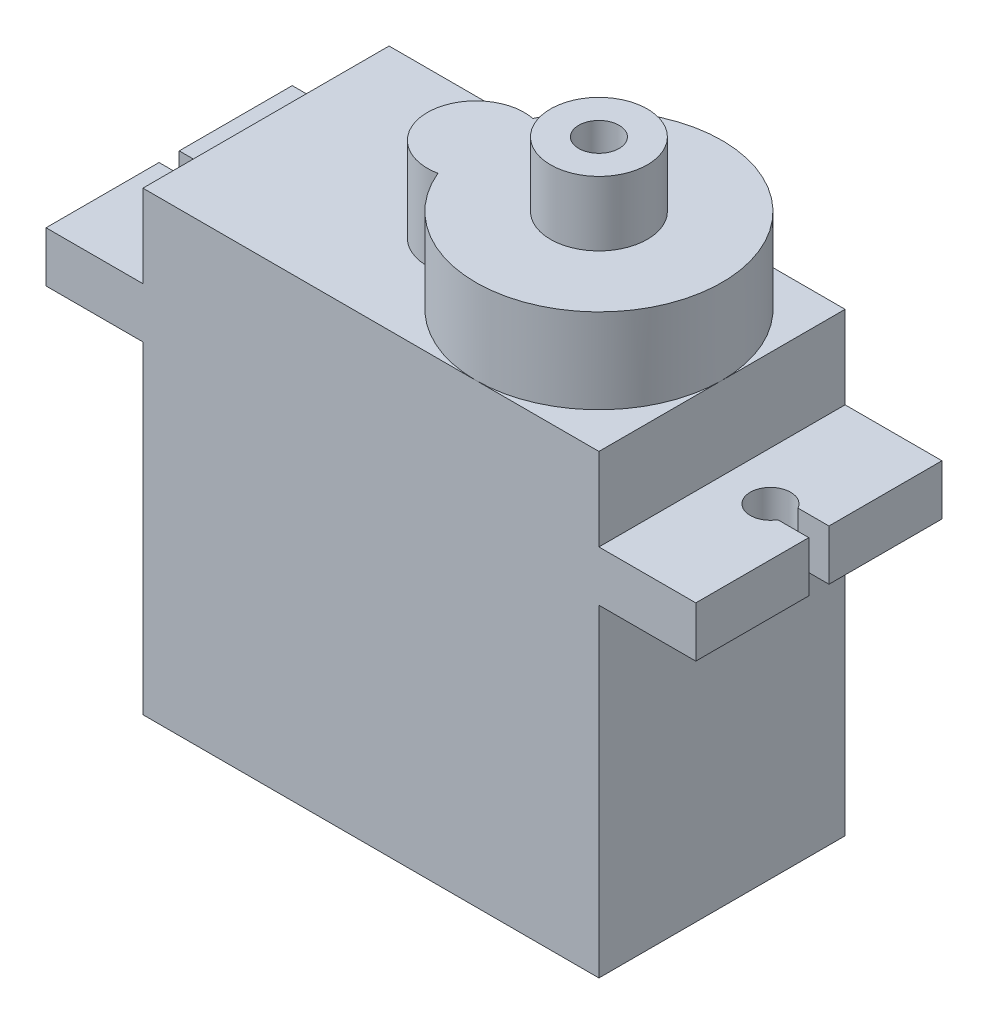
ISO-10303-21;
HEADER;
FILE_DESCRIPTION(('STEP AP214'),'2;1');
FILE_NAME('part.step','',(''),(''),'','','');
FILE_SCHEMA(('AUTOMOTIVE_DESIGN { 1 0 10303 214 1 1 1 1 }'));
ENDSEC;
DATA;
#1=APPLICATION_CONTEXT('core data for automotive mechanical design processes');
#2=APPLICATION_PROTOCOL_DEFINITION('international standard','automotive_design',2000,#1);
#3=PRODUCT_CONTEXT('',#1,'mechanical');
#4=PRODUCT('Part','Part','',(#3));
#5=PRODUCT_RELATED_PRODUCT_CATEGORY('part','',(#4));
#6=PRODUCT_DEFINITION_FORMATION('','',#4);
#7=PRODUCT_DEFINITION_CONTEXT('part definition',#1,'design');
#8=PRODUCT_DEFINITION('design','',#6,#7);
#9=PRODUCT_DEFINITION_SHAPE('','',#8);
#10=(LENGTH_UNIT() NAMED_UNIT(*) SI_UNIT(.MILLI.,.METRE.));
#11=(NAMED_UNIT(*) PLANE_ANGLE_UNIT() SI_UNIT($,.RADIAN.));
#12=(NAMED_UNIT(*) SI_UNIT($,.STERADIAN.) SOLID_ANGLE_UNIT());
#13=UNCERTAINTY_MEASURE_WITH_UNIT(LENGTH_MEASURE(1.E-05),#10,'distance_accuracy_value','');
#14=(GEOMETRIC_REPRESENTATION_CONTEXT(3) GLOBAL_UNCERTAINTY_ASSIGNED_CONTEXT((#13)) GLOBAL_UNIT_ASSIGNED_CONTEXT((#10,
#11,#12)) REPRESENTATION_CONTEXT('',''));
#15=CARTESIAN_POINT('',(0.,0.,0.));
#16=DIRECTION('',(0.,0.,1.));
#17=DIRECTION('',(1.,0.,0.));
#18=AXIS2_PLACEMENT_3D('',#15,#16,#17);
#19=CARTESIAN_POINT('',(-16.1,0.,0.));
#20=DIRECTION('',(1.,0.,0.));
#21=DIRECTION('',(0.,0.,-1.));
#22=AXIS2_PLACEMENT_3D('',#19,#20,#21);
#23=PLANE('',#22);
#24=DIRECTION('',(0.,0.,1.));
#25=VECTOR('',#24,1.);
#26=CARTESIAN_POINT('',(-16.1,16.,-6.1));
#27=LINE('',#26,#25);
#28=CARTESIAN_POINT('',(-16.1,16.,-6.1));
#29=VERTEX_POINT('',#28);
#30=CARTESIAN_POINT('',(-16.1,16.,-0.5));
#31=VERTEX_POINT('',#30);
#32=EDGE_CURVE('E214',#29,#31,#27,.T.);
#33=ORIENTED_EDGE('',*,*,#32,.T.);
#34=DIRECTION('',(0.,1.,0.));
#35=VECTOR('',#34,1.);
#36=CARTESIAN_POINT('',(-16.1,0.,-0.5));
#37=LINE('',#36,#35);
#38=CARTESIAN_POINT('',(-16.1,18.5,-0.5));
#39=VERTEX_POINT('',#38);
#40=EDGE_CURVE('E11',#31,#39,#37,.T.);
#41=ORIENTED_EDGE('',*,*,#40,.T.);
#42=DIRECTION('',(0.,0.,-1.));
#43=VECTOR('',#42,1.);
#44=CARTESIAN_POINT('',(-16.1,18.5,-6.1));
#45=LINE('',#44,#43);
#46=CARTESIAN_POINT('',(-16.1,18.5,-6.1));
#47=VERTEX_POINT('',#46);
#48=EDGE_CURVE('E212',#39,#47,#45,.T.);
#49=ORIENTED_EDGE('',*,*,#48,.T.);
#50=DIRECTION('',(0.,-1.,0.));
#51=VECTOR('',#50,1.);
#52=CARTESIAN_POINT('',(-16.1,16.,-6.1));
#53=LINE('',#52,#51);
#54=EDGE_CURVE('E238',#47,#29,#53,.T.);
#55=ORIENTED_EDGE('',*,*,#54,.T.);
#56=EDGE_LOOP('',(#33,#41,#49,#55));
#57=FACE_BOUND('',#56,.T.);
#58=ADVANCED_FACE('F38',(#57),#23,.F.);
#59=CARTESIAN_POINT('',(16.1,0.,0.));
#60=DIRECTION('',(-1.,0.,0.));
#61=DIRECTION('',(0.,0.,1.));
#62=AXIS2_PLACEMENT_3D('',#59,#60,#61);
#63=PLANE('',#62);
#64=DIRECTION('',(0.,-1.,0.));
#65=VECTOR('',#64,1.);
#66=CARTESIAN_POINT('',(16.1,0.,0.5));
#67=LINE('',#66,#65);
#68=CARTESIAN_POINT('',(16.1,18.5,0.5));
#69=VERTEX_POINT('',#68);
#70=CARTESIAN_POINT('',(16.1,16.,0.5));
#71=VERTEX_POINT('',#70);
#72=EDGE_CURVE('E307',#69,#71,#67,.T.);
#73=ORIENTED_EDGE('',*,*,#72,.F.);
#74=DIRECTION('',(0.,0.,1.));
#75=VECTOR('',#74,1.);
#76=CARTESIAN_POINT('',(16.1,18.5,6.1));
#77=LINE('',#76,#75);
#78=CARTESIAN_POINT('',(16.1,18.5,6.1));
#79=VERTEX_POINT('',#78);
#80=EDGE_CURVE('E361',#69,#79,#77,.T.);
#81=ORIENTED_EDGE('',*,*,#80,.T.);
#82=DIRECTION('',(0.,-1.,0.));
#83=VECTOR('',#82,1.);
#84=CARTESIAN_POINT('',(16.1,16.,6.1));
#85=LINE('',#84,#83);
#86=CARTESIAN_POINT('',(16.1,16.,6.1));
#87=VERTEX_POINT('',#86);
#88=EDGE_CURVE('E352',#79,#87,#85,.T.);
#89=ORIENTED_EDGE('',*,*,#88,.T.);
#90=DIRECTION('',(0.,0.,-1.));
#91=VECTOR('',#90,1.);
#92=CARTESIAN_POINT('',(16.1,16.,6.1));
#93=LINE('',#92,#91);
#94=EDGE_CURVE('E365',#87,#71,#93,.T.);
#95=ORIENTED_EDGE('',*,*,#94,.T.);
#96=EDGE_LOOP('',(#73,#81,#89,#95));
#97=FACE_BOUND('',#96,.T.);
#98=ADVANCED_FACE('F520',(#97),#63,.F.);
#99=CARTESIAN_POINT('',(0.,22.6,0.));
#100=DIRECTION('',(0.,-1.,0.));
#101=DIRECTION('',(0.,0.,-1.));
#102=AXIS2_PLACEMENT_3D('',#99,#100,#101);
#103=PLANE('',#102);
#104=CARTESIAN_POINT('',(-0.9,22.6,0.));
#105=DIRECTION('',(0.,1.,0.));
#106=DIRECTION('',(0.,0.,1.));
#107=AXIS2_PLACEMENT_3D('',#104,#105,#106);
#108=CIRCLE('',#107,2.4);
#109=CARTESIAN_POINT('',(-0.427868852459018,22.6,-2.35310267084154));
#110=VERTEX_POINT('',#109);
#111=CARTESIAN_POINT('',(-0.427868852459017,22.6,2.35310267084155));
#112=VERTEX_POINT('',#111);
#113=EDGE_CURVE('E386',#110,#112,#108,.T.);
#114=ORIENTED_EDGE('',*,*,#113,.F.);
#115=CARTESIAN_POINT('',(5.2,22.6,0.));
#116=DIRECTION('',(0.,1.,0.));
#117=DIRECTION('',(0.,0.,1.));
#118=AXIS2_PLACEMENT_3D('',#115,#116,#117);
#119=CIRCLE('',#118,6.1);
#120=CARTESIAN_POINT('',(5.2,22.6,-6.1));
#121=VERTEX_POINT('',#120);
#122=EDGE_CURVE('E306',#121,#110,#119,.T.);
#123=ORIENTED_EDGE('',*,*,#122,.F.);
#124=DIRECTION('',(-1.,0.,0.));
#125=VECTOR('',#124,1.);
#126=CARTESIAN_POINT('',(11.3,22.6,-6.1));
#127=LINE('',#126,#125);
#128=CARTESIAN_POINT('',(-11.3,22.6,-6.1));
#129=VERTEX_POINT('',#128);
#130=EDGE_CURVE('E269',#121,#129,#127,.T.);
#131=ORIENTED_EDGE('',*,*,#130,.T.);
#132=DIRECTION('',(0.,0.,1.));
#133=VECTOR('',#132,1.);
#134=CARTESIAN_POINT('',(-11.3,22.6,-6.1));
#135=LINE('',#134,#133);
#136=CARTESIAN_POINT('',(-11.3,22.6,6.1));
#137=VERTEX_POINT('',#136);
#138=EDGE_CURVE('E254',#129,#137,#135,.T.);
#139=ORIENTED_EDGE('',*,*,#138,.T.);
#140=DIRECTION('',(1.,0.,0.));
#141=VECTOR('',#140,1.);
#142=CARTESIAN_POINT('',(11.3,22.6,6.1));
#143=LINE('',#142,#141);
#144=CARTESIAN_POINT('',(5.2,22.6,6.1));
#145=VERTEX_POINT('',#144);
#146=EDGE_CURVE('E260',#137,#145,#143,.T.);
#147=ORIENTED_EDGE('',*,*,#146,.T.);
#148=EDGE_CURVE('E381',#112,#145,#119,.T.);
#149=ORIENTED_EDGE('',*,*,#148,.F.);
#150=EDGE_LOOP('',(#114,#123,#131,#139,#147,#149));
#151=FACE_BOUND('',#150,.T.);
#152=ADVANCED_FACE('F504',(#151),#103,.F.);
#153=CARTESIAN_POINT('',(11.3,22.6,0.));
#154=VERTEX_POINT('',#153);
#155=EDGE_CURVE('E311',#145,#154,#119,.T.);
#156=ORIENTED_EDGE('',*,*,#155,.F.);
#157=CARTESIAN_POINT('',(11.3,22.6,6.1));
#158=VERTEX_POINT('',#157);
#159=EDGE_CURVE('E258',#145,#158,#143,.T.);
#160=ORIENTED_EDGE('',*,*,#159,.T.);
#161=DIRECTION('',(0.,0.,-1.));
#162=VECTOR('',#161,1.);
#163=CARTESIAN_POINT('',(11.3,22.6,-6.1));
#164=LINE('',#163,#162);
#165=EDGE_CURVE('E265',#158,#154,#164,.T.);
#166=ORIENTED_EDGE('',*,*,#165,.T.);
#167=EDGE_LOOP('',(#156,#160,#166));
#168=FACE_BOUND('',#167,.T.);
#169=ADVANCED_FACE('F473',(#168),#103,.F.);
#170=CARTESIAN_POINT('',(11.3,22.6,-6.1));
#171=DIRECTION('',(-1.,0.,0.));
#172=DIRECTION('',(0.,0.,1.));
#173=AXIS2_PLACEMENT_3D('',#170,#171,#172);
#174=PLANE('',#173);
#175=DIRECTION('',(0.,0.,1.));
#176=VECTOR('',#175,1.);
#177=CARTESIAN_POINT('',(11.3,18.5,6.1));
#178=LINE('',#177,#176);
#179=CARTESIAN_POINT('',(11.3,18.5,-6.1));
#180=VERTEX_POINT('',#179);
#181=CARTESIAN_POINT('',(11.3,18.5,6.1));
#182=VERTEX_POINT('',#181);
#183=EDGE_CURVE('E348',#180,#182,#178,.T.);
#184=ORIENTED_EDGE('',*,*,#183,.F.);
#185=DIRECTION('',(0.,-1.,0.));
#186=VECTOR('',#185,1.);
#187=CARTESIAN_POINT('',(11.3,22.6,-6.1));
#188=LINE('',#187,#186);
#189=CARTESIAN_POINT('',(11.3,22.6,-6.1));
#190=VERTEX_POINT('',#189);
#191=EDGE_CURVE('E293',#190,#180,#188,.T.);
#192=ORIENTED_EDGE('',*,*,#191,.F.);
#193=EDGE_CURVE('E264',#154,#190,#164,.T.);
#194=ORIENTED_EDGE('',*,*,#193,.F.);
#195=ORIENTED_EDGE('',*,*,#165,.F.);
#196=DIRECTION('',(0.,-1.,0.));
#197=VECTOR('',#196,1.);
#198=CARTESIAN_POINT('',(11.3,22.6,6.1));
#199=LINE('',#198,#197);
#200=EDGE_CURVE('E298',#158,#182,#199,.T.);
#201=ORIENTED_EDGE('',*,*,#200,.T.);
#202=EDGE_LOOP('',(#184,#192,#194,#195,#201));
#203=FACE_BOUND('',#202,.T.);
#204=ADVANCED_FACE('F482',(#203),#174,.F.);
#205=DIRECTION('',(0.,0.,-1.));
#206=VECTOR('',#205,1.);
#207=CARTESIAN_POINT('',(11.3,16.,6.1));
#208=LINE('',#207,#206);
#209=CARTESIAN_POINT('',(11.3,16.,6.1));
#210=VERTEX_POINT('',#209);
#211=CARTESIAN_POINT('',(11.3,16.,-6.1));
#212=VERTEX_POINT('',#211);
#213=EDGE_CURVE('E353',#210,#212,#208,.T.);
#214=ORIENTED_EDGE('',*,*,#213,.F.);
#215=CARTESIAN_POINT('',(11.3,0.,6.1));
#216=VERTEX_POINT('',#215);
#217=EDGE_CURVE('E297',#210,#216,#199,.T.);
#218=ORIENTED_EDGE('',*,*,#217,.T.);
#219=DIRECTION('',(0.,0.,-1.));
#220=VECTOR('',#219,1.);
#221=CARTESIAN_POINT('',(11.3,0.,-6.1));
#222=LINE('',#221,#220);
#223=CARTESIAN_POINT('',(11.3,0.,-6.1));
#224=VERTEX_POINT('',#223);
#225=EDGE_CURVE('E282',#216,#224,#222,.T.);
#226=ORIENTED_EDGE('',*,*,#225,.T.);
#227=EDGE_CURVE('E292',#212,#224,#188,.T.);
#228=ORIENTED_EDGE('',*,*,#227,.F.);
#229=EDGE_LOOP('',(#214,#218,#226,#228));
#230=FACE_BOUND('',#229,.T.);
#231=ADVANCED_FACE('F512',(#230),#174,.F.);
#232=CARTESIAN_POINT('',(-11.3,22.6,-6.1));
#233=DIRECTION('',(1.,0.,0.));
#234=DIRECTION('',(0.,0.,-1.));
#235=AXIS2_PLACEMENT_3D('',#232,#233,#234);
#236=PLANE('',#235);
#237=DIRECTION('',(0.,0.,-1.));
#238=VECTOR('',#237,1.);
#239=CARTESIAN_POINT('',(-11.3,18.5,-6.1));
#240=LINE('',#239,#238);
#241=CARTESIAN_POINT('',(-11.3,18.5,6.1));
#242=VERTEX_POINT('',#241);
#243=CARTESIAN_POINT('',(-11.3,18.5,-6.1));
#244=VERTEX_POINT('',#243);
#245=EDGE_CURVE('E234',#242,#244,#240,.T.);
#246=ORIENTED_EDGE('',*,*,#245,.F.);
#247=DIRECTION('',(0.,-1.,0.));
#248=VECTOR('',#247,1.);
#249=CARTESIAN_POINT('',(-11.3,22.6,6.1));
#250=LINE('',#249,#248);
#251=EDGE_CURVE('E302',#137,#242,#250,.T.);
#252=ORIENTED_EDGE('',*,*,#251,.F.);
#253=ORIENTED_EDGE('',*,*,#138,.F.);
#254=DIRECTION('',(0.,-1.,0.));
#255=VECTOR('',#254,1.);
#256=CARTESIAN_POINT('',(-11.3,22.6,-6.1));
#257=LINE('',#256,#255);
#258=EDGE_CURVE('E289',#129,#244,#257,.T.);
#259=ORIENTED_EDGE('',*,*,#258,.T.);
#260=EDGE_LOOP('',(#246,#252,#253,#259));
#261=FACE_BOUND('',#260,.T.);
#262=ADVANCED_FACE('F40',(#261),#236,.F.);
#263=DIRECTION('',(0.,0.,1.));
#264=VECTOR('',#263,1.);
#265=CARTESIAN_POINT('',(-11.3,16.,-6.1));
#266=LINE('',#265,#264);
#267=CARTESIAN_POINT('',(-11.3,16.,-6.1));
#268=VERTEX_POINT('',#267);
#269=CARTESIAN_POINT('',(-11.3,16.,6.1));
#270=VERTEX_POINT('',#269);
#271=EDGE_CURVE('E230',#268,#270,#266,.T.);
#272=ORIENTED_EDGE('',*,*,#271,.F.);
#273=CARTESIAN_POINT('',(-11.3,0.,-6.1));
#274=VERTEX_POINT('',#273);
#275=EDGE_CURVE('E274',#268,#274,#257,.T.);
#276=ORIENTED_EDGE('',*,*,#275,.T.);
#277=DIRECTION('',(0.,0.,1.));
#278=VECTOR('',#277,1.);
#279=CARTESIAN_POINT('',(-11.3,0.,-6.1));
#280=LINE('',#279,#278);
#281=CARTESIAN_POINT('',(-11.3,0.,6.1));
#282=VERTEX_POINT('',#281);
#283=EDGE_CURVE('E253',#274,#282,#280,.T.);
#284=ORIENTED_EDGE('',*,*,#283,.T.);
#285=EDGE_CURVE('E301',#270,#282,#250,.T.);
#286=ORIENTED_EDGE('',*,*,#285,.F.);
#287=EDGE_LOOP('',(#272,#276,#284,#286));
#288=FACE_BOUND('',#287,.T.);
#289=ADVANCED_FACE('F511',(#288),#236,.F.);
#290=CARTESIAN_POINT('',(11.3,22.6,6.1));
#291=DIRECTION('',(0.,0.,-1.));
#292=DIRECTION('',(-1.,0.,0.));
#293=AXIS2_PLACEMENT_3D('',#290,#291,#292);
#294=PLANE('',#293);
#295=DIRECTION('',(1.,0.,0.));
#296=VECTOR('',#295,1.);
#297=CARTESIAN_POINT('',(11.3,0.,6.1));
#298=LINE('',#297,#296);
#299=EDGE_CURVE('E278',#282,#216,#298,.T.);
#300=ORIENTED_EDGE('',*,*,#299,.T.);
#301=ORIENTED_EDGE('',*,*,#217,.F.);
#302=DIRECTION('',(-1.,0.,0.));
#303=VECTOR('',#302,1.);
#304=CARTESIAN_POINT('',(16.1,16.,6.1));
#305=LINE('',#304,#303);
#306=EDGE_CURVE('E235',#87,#210,#305,.T.);
#307=ORIENTED_EDGE('',*,*,#306,.F.);
#308=ORIENTED_EDGE('',*,*,#88,.F.);
#309=DIRECTION('',(-1.,0.,0.));
#310=VECTOR('',#309,1.);
#311=CARTESIAN_POINT('',(16.1,18.5,6.1));
#312=LINE('',#311,#310);
#313=EDGE_CURVE('E343',#79,#182,#312,.T.);
#314=ORIENTED_EDGE('',*,*,#313,.T.);
#315=ORIENTED_EDGE('',*,*,#200,.F.);
#316=ORIENTED_EDGE('',*,*,#159,.F.);
#317=ORIENTED_EDGE('',*,*,#146,.F.);
#318=ORIENTED_EDGE('',*,*,#251,.T.);
#319=DIRECTION('',(1.,0.,0.));
#320=VECTOR('',#319,1.);
#321=CARTESIAN_POINT('',(-16.1,18.5,6.1));
#322=LINE('',#321,#320);
#323=CARTESIAN_POINT('',(-16.1,18.5,6.1));
#324=VERTEX_POINT('',#323);
#325=EDGE_CURVE('E241',#324,#242,#322,.T.);
#326=ORIENTED_EDGE('',*,*,#325,.F.);
#327=DIRECTION('',(0.,1.,0.));
#328=VECTOR('',#327,1.);
#329=CARTESIAN_POINT('',(-16.1,16.,6.1));
#330=LINE('',#329,#328);
#331=CARTESIAN_POINT('',(-16.1,16.,6.1));
#332=VERTEX_POINT('',#331);
#333=EDGE_CURVE('E222',#332,#324,#330,.T.);
#334=ORIENTED_EDGE('',*,*,#333,.F.);
#335=DIRECTION('',(1.,0.,0.));
#336=VECTOR('',#335,1.);
#337=CARTESIAN_POINT('',(-16.1,16.,6.1));
#338=LINE('',#337,#336);
#339=EDGE_CURVE('E245',#332,#270,#338,.T.);
#340=ORIENTED_EDGE('',*,*,#339,.T.);
#341=ORIENTED_EDGE('',*,*,#285,.T.);
#342=EDGE_LOOP('',(#300,#301,#307,#308,#314,#315,#316,#317,#318,#326,#334,#340,#341));
#343=FACE_BOUND('',#342,.T.);
#344=ADVANCED_FACE('F477',(#343),#294,.F.);
#345=CARTESIAN_POINT('',(11.3,22.6,-6.1));
#346=DIRECTION('',(0.,0.,1.));
#347=DIRECTION('',(1.,0.,0.));
#348=AXIS2_PLACEMENT_3D('',#345,#346,#347);
#349=PLANE('',#348);
#350=DIRECTION('',(-1.,0.,0.));
#351=VECTOR('',#350,1.);
#352=CARTESIAN_POINT('',(11.3,0.,-6.1));
#353=LINE('',#352,#351);
#354=EDGE_CURVE('E259',#224,#274,#353,.T.);
#355=ORIENTED_EDGE('',*,*,#354,.T.);
#356=ORIENTED_EDGE('',*,*,#275,.F.);
#357=DIRECTION('',(1.,0.,0.));
#358=VECTOR('',#357,1.);
#359=CARTESIAN_POINT('',(-16.1,16.,-6.1));
#360=LINE('',#359,#358);
#361=EDGE_CURVE('E249',#29,#268,#360,.T.);
#362=ORIENTED_EDGE('',*,*,#361,.F.);
#363=ORIENTED_EDGE('',*,*,#54,.F.);
#364=DIRECTION('',(1.,0.,0.));
#365=VECTOR('',#364,1.);
#366=CARTESIAN_POINT('',(-16.1,18.5,-6.1));
#367=LINE('',#366,#365);
#368=EDGE_CURVE('E218',#47,#244,#367,.T.);
#369=ORIENTED_EDGE('',*,*,#368,.T.);
#370=ORIENTED_EDGE('',*,*,#258,.F.);
#371=ORIENTED_EDGE('',*,*,#130,.F.);
#372=EDGE_CURVE('E270',#190,#121,#127,.T.);
#373=ORIENTED_EDGE('',*,*,#372,.F.);
#374=ORIENTED_EDGE('',*,*,#191,.T.);
#375=DIRECTION('',(-1.,0.,0.));
#376=VECTOR('',#375,1.);
#377=CARTESIAN_POINT('',(16.1,18.5,-6.1));
#378=LINE('',#377,#376);
#379=CARTESIAN_POINT('',(16.1,18.5,-6.1));
#380=VERTEX_POINT('',#379);
#381=EDGE_CURVE('E339',#380,#180,#378,.T.);
#382=ORIENTED_EDGE('',*,*,#381,.F.);
#383=DIRECTION('',(0.,1.,0.));
#384=VECTOR('',#383,1.);
#385=CARTESIAN_POINT('',(16.1,16.,-6.1));
#386=LINE('',#385,#384);
#387=CARTESIAN_POINT('',(16.1,16.,-6.1));
#388=VERTEX_POINT('',#387);
#389=EDGE_CURVE('E362',#388,#380,#386,.T.);
#390=ORIENTED_EDGE('',*,*,#389,.F.);
#391=DIRECTION('',(-1.,0.,0.));
#392=VECTOR('',#391,1.);
#393=CARTESIAN_POINT('',(16.1,16.,-6.1));
#394=LINE('',#393,#392);
#395=EDGE_CURVE('E335',#388,#212,#394,.T.);
#396=ORIENTED_EDGE('',*,*,#395,.T.);
#397=ORIENTED_EDGE('',*,*,#227,.T.);
#398=EDGE_LOOP('',(#355,#356,#362,#363,#369,#370,#371,#373,#374,#382,#390,#396,#397));
#399=FACE_BOUND('',#398,.T.);
#400=ADVANCED_FACE('F461',(#399),#349,.F.);
#401=EDGE_CURVE('E488',#154,#121,#119,.T.);
#402=ORIENTED_EDGE('',*,*,#401,.F.);
#403=ORIENTED_EDGE('',*,*,#193,.T.);
#404=ORIENTED_EDGE('',*,*,#372,.T.);
#405=EDGE_LOOP('',(#402,#403,#404));
#406=FACE_BOUND('',#405,.T.);
#407=ADVANCED_FACE('F486',(#406),#103,.F.);
#408=CARTESIAN_POINT('',(0.,0.,0.));
#409=DIRECTION('',(0.,-1.,0.));
#410=DIRECTION('',(0.,0.,-1.));
#411=AXIS2_PLACEMENT_3D('',#408,#409,#410);
#412=PLANE('',#411);
#413=ORIENTED_EDGE('',*,*,#283,.F.);
#414=ORIENTED_EDGE('',*,*,#354,.F.);
#415=ORIENTED_EDGE('',*,*,#225,.F.);
#416=ORIENTED_EDGE('',*,*,#299,.F.);
#417=EDGE_LOOP('',(#413,#414,#415,#416));
#418=FACE_BOUND('',#417,.T.);
#419=ADVANCED_FACE('F541',(#418),#412,.T.);
#420=CARTESIAN_POINT('',(-16.1,16.,-6.1));
#421=DIRECTION('',(0.,1.,0.));
#422=DIRECTION('',(0.,0.,1.));
#423=AXIS2_PLACEMENT_3D('',#420,#421,#422);
#424=PLANE('',#423);
#425=CARTESIAN_POINT('',(-13.7,16.,0.));
#426=DIRECTION('',(0.,1.,0.));
#427=DIRECTION('',(0.,0.,1.));
#428=AXIS2_PLACEMENT_3D('',#425,#426,#427);
#429=CIRCLE('',#428,1.);
#430=CARTESIAN_POINT('',(-14.5660254037844,16.,0.5));
#431=VERTEX_POINT('',#430);
#432=CARTESIAN_POINT('',(-14.5660254037844,16.,-0.5));
#433=VERTEX_POINT('',#432);
#434=EDGE_CURVE('E438',#431,#433,#429,.T.);
#435=ORIENTED_EDGE('',*,*,#434,.T.);
#436=DIRECTION('',(-1.,0.,0.));
#437=VECTOR('',#436,1.);
#438=CARTESIAN_POINT('',(-16.1,16.,-0.5));
#439=LINE('',#438,#437);
#440=EDGE_CURVE('E441',#433,#31,#439,.T.);
#441=ORIENTED_EDGE('',*,*,#440,.T.);
#442=ORIENTED_EDGE('',*,*,#32,.F.);
#443=ORIENTED_EDGE('',*,*,#361,.T.);
#444=ORIENTED_EDGE('',*,*,#271,.T.);
#445=ORIENTED_EDGE('',*,*,#339,.F.);
#446=CARTESIAN_POINT('',(-16.1,16.,0.5));
#447=VERTEX_POINT('',#446);
#448=EDGE_CURVE('E318',#447,#332,#27,.T.);
#449=ORIENTED_EDGE('',*,*,#448,.F.);
#450=DIRECTION('',(1.,0.,0.));
#451=VECTOR('',#450,1.);
#452=CARTESIAN_POINT('',(-16.1,16.,0.5));
#453=LINE('',#452,#451);
#454=EDGE_CURVE('E54',#447,#431,#453,.T.);
#455=ORIENTED_EDGE('',*,*,#454,.T.);
#456=EDGE_LOOP('',(#435,#441,#442,#443,#444,#445,#449,#455));
#457=FACE_BOUND('',#456,.T.);
#458=ADVANCED_FACE('F325',(#457),#424,.F.);
#459=CARTESIAN_POINT('',(-16.1,18.5,-6.1));
#460=DIRECTION('',(0.,-1.,0.));
#461=DIRECTION('',(0.,0.,-1.));
#462=AXIS2_PLACEMENT_3D('',#459,#460,#461);
#463=PLANE('',#462);
#464=ORIENTED_EDGE('',*,*,#48,.F.);
#465=DIRECTION('',(-1.,0.,0.));
#466=VECTOR('',#465,1.);
#467=CARTESIAN_POINT('',(-16.1,18.5,-0.5));
#468=LINE('',#467,#466);
#469=CARTESIAN_POINT('',(-14.5660254037844,18.5,-0.5));
#470=VERTEX_POINT('',#469);
#471=EDGE_CURVE('E197',#470,#39,#468,.T.);
#472=ORIENTED_EDGE('',*,*,#471,.F.);
#473=CARTESIAN_POINT('',(-13.7,18.5,0.));
#474=DIRECTION('',(0.,1.,0.));
#475=DIRECTION('',(0.,0.,1.));
#476=AXIS2_PLACEMENT_3D('',#473,#474,#475);
#477=CIRCLE('',#476,1.);
#478=CARTESIAN_POINT('',(-14.5660254037844,18.5,0.5));
#479=VERTEX_POINT('',#478);
#480=EDGE_CURVE('E449',#479,#470,#477,.T.);
#481=ORIENTED_EDGE('',*,*,#480,.F.);
#482=DIRECTION('',(1.,0.,0.));
#483=VECTOR('',#482,1.);
#484=CARTESIAN_POINT('',(-16.1,18.5,0.5));
#485=LINE('',#484,#483);
#486=CARTESIAN_POINT('',(-16.1,18.5,0.5));
#487=VERTEX_POINT('',#486);
#488=EDGE_CURVE('E207',#487,#479,#485,.T.);
#489=ORIENTED_EDGE('',*,*,#488,.F.);
#490=EDGE_CURVE('E221',#324,#487,#45,.T.);
#491=ORIENTED_EDGE('',*,*,#490,.F.);
#492=ORIENTED_EDGE('',*,*,#325,.T.);
#493=ORIENTED_EDGE('',*,*,#245,.T.);
#494=ORIENTED_EDGE('',*,*,#368,.F.);
#495=EDGE_LOOP('',(#464,#472,#481,#489,#491,#492,#493,#494));
#496=FACE_BOUND('',#495,.T.);
#497=ADVANCED_FACE('F215',(#496),#463,.F.);
#498=ORIENTED_EDGE('',*,*,#490,.T.);
#499=DIRECTION('',(0.,-1.,0.));
#500=VECTOR('',#499,1.);
#501=CARTESIAN_POINT('',(-16.1,0.,0.5));
#502=LINE('',#501,#500);
#503=EDGE_CURVE('E47',#487,#447,#502,.T.);
#504=ORIENTED_EDGE('',*,*,#503,.T.);
#505=ORIENTED_EDGE('',*,*,#448,.T.);
#506=ORIENTED_EDGE('',*,*,#333,.T.);
#507=EDGE_LOOP('',(#498,#504,#505,#506));
#508=FACE_BOUND('',#507,.T.);
#509=ADVANCED_FACE('F317',(#508),#23,.F.);
#510=CARTESIAN_POINT('',(16.1,16.,6.1));
#511=DIRECTION('',(0.,1.,0.));
#512=DIRECTION('',(0.,0.,1.));
#513=AXIS2_PLACEMENT_3D('',#510,#511,#512);
#514=PLANE('',#513);
#515=CARTESIAN_POINT('',(16.1,16.,-0.5));
#516=VERTEX_POINT('',#515);
#517=EDGE_CURVE('E369',#516,#388,#93,.T.);
#518=ORIENTED_EDGE('',*,*,#517,.F.);
#519=DIRECTION('',(-1.,0.,0.));
#520=VECTOR('',#519,1.);
#521=CARTESIAN_POINT('',(16.1,16.,-0.5));
#522=LINE('',#521,#520);
#523=CARTESIAN_POINT('',(14.5660254037844,16.,-0.499999999999999));
#524=VERTEX_POINT('',#523);
#525=EDGE_CURVE('E415',#516,#524,#522,.T.);
#526=ORIENTED_EDGE('',*,*,#525,.T.);
#527=CARTESIAN_POINT('',(13.7,16.,0.));
#528=DIRECTION('',(0.,1.,0.));
#529=DIRECTION('',(0.,0.,1.));
#530=AXIS2_PLACEMENT_3D('',#527,#528,#529);
#531=CIRCLE('',#530,1.);
#532=CARTESIAN_POINT('',(14.5660254037844,16.,0.500000000000001));
#533=VERTEX_POINT('',#532);
#534=EDGE_CURVE('E411',#524,#533,#531,.T.);
#535=ORIENTED_EDGE('',*,*,#534,.T.);
#536=DIRECTION('',(-1.,0.,0.));
#537=VECTOR('',#536,1.);
#538=CARTESIAN_POINT('',(16.1,16.,0.5));
#539=LINE('',#538,#537);
#540=EDGE_CURVE('E419',#71,#533,#539,.T.);
#541=ORIENTED_EDGE('',*,*,#540,.F.);
#542=ORIENTED_EDGE('',*,*,#94,.F.);
#543=ORIENTED_EDGE('',*,*,#306,.T.);
#544=ORIENTED_EDGE('',*,*,#213,.T.);
#545=ORIENTED_EDGE('',*,*,#395,.F.);
#546=EDGE_LOOP('',(#518,#526,#535,#541,#542,#543,#544,#545));
#547=FACE_BOUND('',#546,.T.);
#548=ADVANCED_FACE('F531',(#547),#514,.F.);
#549=CARTESIAN_POINT('',(16.1,18.5,6.1));
#550=DIRECTION('',(0.,-1.,0.));
#551=DIRECTION('',(0.,0.,-1.));
#552=AXIS2_PLACEMENT_3D('',#549,#550,#551);
#553=PLANE('',#552);
#554=CARTESIAN_POINT('',(13.7,18.5,0.));
#555=DIRECTION('',(0.,1.,0.));
#556=DIRECTION('',(0.,0.,1.));
#557=AXIS2_PLACEMENT_3D('',#554,#555,#556);
#558=CIRCLE('',#557,1.);
#559=CARTESIAN_POINT('',(14.5660254037844,18.5,-0.499999999999999));
#560=VERTEX_POINT('',#559);
#561=CARTESIAN_POINT('',(14.5660254037844,18.5,0.500000000000001));
#562=VERTEX_POINT('',#561);
#563=EDGE_CURVE('E430',#560,#562,#558,.T.);
#564=ORIENTED_EDGE('',*,*,#563,.F.);
#565=DIRECTION('',(-1.,0.,0.));
#566=VECTOR('',#565,1.);
#567=CARTESIAN_POINT('',(16.1,18.5,-0.5));
#568=LINE('',#567,#566);
#569=CARTESIAN_POINT('',(16.1,18.5,-0.5));
#570=VERTEX_POINT('',#569);
#571=EDGE_CURVE('E434',#570,#560,#568,.T.);
#572=ORIENTED_EDGE('',*,*,#571,.F.);
#573=EDGE_CURVE('E347',#380,#570,#77,.T.);
#574=ORIENTED_EDGE('',*,*,#573,.F.);
#575=ORIENTED_EDGE('',*,*,#381,.T.);
#576=ORIENTED_EDGE('',*,*,#183,.T.);
#577=ORIENTED_EDGE('',*,*,#313,.F.);
#578=ORIENTED_EDGE('',*,*,#80,.F.);
#579=DIRECTION('',(-1.,0.,0.));
#580=VECTOR('',#579,1.);
#581=CARTESIAN_POINT('',(16.1,18.5,0.5));
#582=LINE('',#581,#580);
#583=EDGE_CURVE('E62',#69,#562,#582,.T.);
#584=ORIENTED_EDGE('',*,*,#583,.T.);
#585=EDGE_LOOP('',(#564,#572,#574,#575,#576,#577,#578,#584));
#586=FACE_BOUND('',#585,.T.);
#587=ADVANCED_FACE('F536',(#586),#553,.F.);
#588=ORIENTED_EDGE('',*,*,#573,.T.);
#589=DIRECTION('',(0.,-1.,0.));
#590=VECTOR('',#589,1.);
#591=CARTESIAN_POINT('',(16.1,0.,-0.5));
#592=LINE('',#591,#590);
#593=EDGE_CURVE('E310',#570,#516,#592,.T.);
#594=ORIENTED_EDGE('',*,*,#593,.T.);
#595=ORIENTED_EDGE('',*,*,#517,.T.);
#596=ORIENTED_EDGE('',*,*,#389,.T.);
#597=EDGE_LOOP('',(#588,#594,#595,#596));
#598=FACE_BOUND('',#597,.T.);
#599=ADVANCED_FACE('F527',(#598),#63,.F.);
#600=CARTESIAN_POINT('',(-0.9,26.8,0.));
#601=DIRECTION('',(0.,-1.,0.));
#602=DIRECTION('',(0.,0.,-1.));
#603=AXIS2_PLACEMENT_3D('',#600,#601,#602);
#604=CYLINDRICAL_SURFACE('',#603,2.4);
#605=ORIENTED_EDGE('',*,*,#113,.T.);
#606=DIRECTION('',(0.,-1.,0.));
#607=VECTOR('',#606,1.);
#608=CARTESIAN_POINT('',(-0.427868852459017,26.8,2.35310267084155));
#609=LINE('',#608,#607);
#610=CARTESIAN_POINT('',(-0.427868852459017,26.8,2.35310267084155));
#611=VERTEX_POINT('',#610);
#612=EDGE_CURVE('E357',#611,#112,#609,.T.);
#613=ORIENTED_EDGE('',*,*,#612,.F.);
#614=CARTESIAN_POINT('',(-0.9,26.8,0.));
#615=DIRECTION('',(0.,1.,0.));
#616=DIRECTION('',(0.,0.,1.));
#617=AXIS2_PLACEMENT_3D('',#614,#615,#616);
#618=CIRCLE('',#617,2.4);
#619=CARTESIAN_POINT('',(-0.427868852459018,26.8,-2.35310267084154));
#620=VERTEX_POINT('',#619);
#621=EDGE_CURVE('E385',#620,#611,#618,.T.);
#622=ORIENTED_EDGE('',*,*,#621,.F.);
#623=DIRECTION('',(0.,-1.,0.));
#624=VECTOR('',#623,1.);
#625=CARTESIAN_POINT('',(-0.427868852459018,26.8,-2.35310267084154));
#626=LINE('',#625,#624);
#627=EDGE_CURVE('E376',#620,#110,#626,.T.);
#628=ORIENTED_EDGE('',*,*,#627,.T.);
#629=EDGE_LOOP('',(#605,#613,#622,#628));
#630=FACE_BOUND('',#629,.T.);
#631=ADVANCED_FACE('F500',(#630),#604,.T.);
#632=CARTESIAN_POINT('',(5.2,26.8,0.));
#633=DIRECTION('',(0.,-1.,0.));
#634=DIRECTION('',(0.,0.,-1.));
#635=AXIS2_PLACEMENT_3D('',#632,#633,#634);
#636=CYLINDRICAL_SURFACE('',#635,6.1);
#637=ORIENTED_EDGE('',*,*,#148,.T.);
#638=ORIENTED_EDGE('',*,*,#155,.T.);
#639=ORIENTED_EDGE('',*,*,#401,.T.);
#640=ORIENTED_EDGE('',*,*,#122,.T.);
#641=ORIENTED_EDGE('',*,*,#627,.F.);
#642=CARTESIAN_POINT('',(5.2,26.8,0.));
#643=DIRECTION('',(0.,1.,0.));
#644=DIRECTION('',(0.,0.,1.));
#645=AXIS2_PLACEMENT_3D('',#642,#643,#644);
#646=CIRCLE('',#645,6.1);
#647=EDGE_CURVE('E380',#611,#620,#646,.T.);
#648=ORIENTED_EDGE('',*,*,#647,.F.);
#649=ORIENTED_EDGE('',*,*,#612,.T.);
#650=EDGE_LOOP('',(#637,#638,#639,#640,#641,#648,#649));
#651=FACE_BOUND('',#650,.T.);
#652=ADVANCED_FACE('F495',(#651),#636,.T.);
#653=CARTESIAN_POINT('',(2.15,26.8,0.));
#654=DIRECTION('',(0.,1.,0.));
#655=DIRECTION('',(0.,0.,1.));
#656=AXIS2_PLACEMENT_3D('',#653,#654,#655);
#657=PLANE('',#656);
#658=CARTESIAN_POINT('',(5.2,26.8,0.));
#659=DIRECTION('',(0.,1.,0.));
#660=DIRECTION('',(0.,0.,1.));
#661=AXIS2_PLACEMENT_3D('',#658,#659,#660);
#662=CIRCLE('',#661,2.4);
#663=CARTESIAN_POINT('',(5.2,26.8,2.4));
#664=VERTEX_POINT('',#663);
#665=EDGE_CURVE('E396',#664,#664,#662,.T.);
#666=ORIENTED_EDGE('',*,*,#665,.F.);
#667=EDGE_LOOP('',(#666));
#668=FACE_BOUND('',#667,.T.);
#669=ORIENTED_EDGE('',*,*,#621,.T.);
#670=ORIENTED_EDGE('',*,*,#647,.T.);
#671=EDGE_LOOP('',(#669,#670));
#672=FACE_BOUND('',#671,.T.);
#673=ADVANCED_FACE('F503',(#668,#672),#657,.T.);
#674=CARTESIAN_POINT('',(5.2,30.,0.));
#675=DIRECTION('',(0.,-1.,0.));
#676=DIRECTION('',(0.,0.,-1.));
#677=AXIS2_PLACEMENT_3D('',#674,#675,#676);
#678=CYLINDRICAL_SURFACE('',#677,2.4);
#679=CARTESIAN_POINT('',(5.2,30.,0.));
#680=DIRECTION('',(0.,1.,0.));
#681=DIRECTION('',(0.,0.,1.));
#682=AXIS2_PLACEMENT_3D('',#679,#680,#681);
#683=CIRCLE('',#682,2.4);
#684=CARTESIAN_POINT('',(5.2,30.,2.4));
#685=VERTEX_POINT('',#684);
#686=EDGE_CURVE('E390',#685,#685,#683,.T.);
#687=ORIENTED_EDGE('',*,*,#686,.F.);
#688=EDGE_LOOP('',(#687));
#689=FACE_BOUND('',#688,.T.);
#690=ORIENTED_EDGE('',*,*,#665,.T.);
#691=EDGE_LOOP('',(#690));
#692=FACE_BOUND('',#691,.T.);
#693=ADVANCED_FACE('F638',(#689,#692),#678,.T.);
#694=CARTESIAN_POINT('',(5.2,30.,0.));
#695=DIRECTION('',(0.,1.,0.));
#696=DIRECTION('',(0.,0.,1.));
#697=AXIS2_PLACEMENT_3D('',#694,#695,#696);
#698=PLANE('',#697);
#699=CARTESIAN_POINT('',(5.2,30.,0.));
#700=DIRECTION('',(0.,1.,0.));
#701=DIRECTION('',(0.,0.,1.));
#702=AXIS2_PLACEMENT_3D('',#699,#700,#701);
#703=CIRCLE('',#702,1.);
#704=CARTESIAN_POINT('',(5.2,30.,0.999999999999999));
#705=VERTEX_POINT('',#704);
#706=EDGE_CURVE('E407',#705,#705,#703,.T.);
#707=ORIENTED_EDGE('',*,*,#706,.F.);
#708=EDGE_LOOP('',(#707));
#709=FACE_BOUND('',#708,.T.);
#710=ORIENTED_EDGE('',*,*,#686,.T.);
#711=EDGE_LOOP('',(#710));
#712=FACE_BOUND('',#711,.T.);
#713=ADVANCED_FACE('F634',(#709,#712),#698,.T.);
#714=CARTESIAN_POINT('',(5.2,23.9715728752538,0.));
#715=DIRECTION('',(0.,1.,0.));
#716=DIRECTION('',(0.,0.,1.));
#717=AXIS2_PLACEMENT_3D('',#714,#715,#716);
#718=CYLINDRICAL_SURFACE('',#717,1.);
#719=CARTESIAN_POINT('',(5.2,26.8,0.));
#720=DIRECTION('',(0.,1.,0.));
#721=DIRECTION('',(0.,0.,1.));
#722=AXIS2_PLACEMENT_3D('',#719,#720,#721);
#723=CIRCLE('',#722,1.);
#724=CARTESIAN_POINT('',(5.2,26.8,0.999999999999999));
#725=VERTEX_POINT('',#724);
#726=EDGE_CURVE('E400',#725,#725,#723,.F.);
#727=ORIENTED_EDGE('',*,*,#726,.T.);
#728=EDGE_LOOP('',(#727));
#729=FACE_BOUND('',#728,.T.);
#730=ORIENTED_EDGE('',*,*,#706,.T.);
#731=EDGE_LOOP('',(#730));
#732=FACE_BOUND('',#731,.T.);
#733=ADVANCED_FACE('F630',(#729,#732),#718,.F.);
#734=CARTESIAN_POINT('',(2.15,26.8,0.));
#735=DIRECTION('',(0.,1.,0.));
#736=DIRECTION('',(0.,0.,1.));
#737=AXIS2_PLACEMENT_3D('',#734,#735,#736);
#738=PLANE('',#737);
#739=ORIENTED_EDGE('',*,*,#726,.F.);
#740=EDGE_LOOP('',(#739));
#741=FACE_BOUND('',#740,.T.);
#742=ADVANCED_FACE('F623',(#741),#738,.T.);
#743=CARTESIAN_POINT('',(13.7,0.,0.));
#744=DIRECTION('',(0.,1.,0.));
#745=DIRECTION('',(0.,0.,1.));
#746=AXIS2_PLACEMENT_3D('',#743,#744,#745);
#747=CYLINDRICAL_SURFACE('',#746,1.);
#748=DIRECTION('',(0.,1.,0.));
#749=VECTOR('',#748,1.);
#750=CARTESIAN_POINT('',(14.5660254037844,0.,-0.499999999999999));
#751=LINE('',#750,#749);
#752=EDGE_CURVE('E423',#524,#560,#751,.T.);
#753=ORIENTED_EDGE('',*,*,#752,.T.);
#754=ORIENTED_EDGE('',*,*,#563,.T.);
#755=DIRECTION('',(0.,1.,0.));
#756=VECTOR('',#755,1.);
#757=CARTESIAN_POINT('',(14.5660254037844,0.,0.500000000000001));
#758=LINE('',#757,#756);
#759=EDGE_CURVE('E422',#533,#562,#758,.T.);
#760=ORIENTED_EDGE('',*,*,#759,.F.);
#761=ORIENTED_EDGE('',*,*,#534,.F.);
#762=EDGE_LOOP('',(#753,#754,#760,#761));
#763=FACE_BOUND('',#762,.T.);
#764=ADVANCED_FACE('F620',(#763),#747,.F.);
#765=CARTESIAN_POINT('',(16.1,0.,-0.5));
#766=DIRECTION('',(0.,0.,-1.));
#767=DIRECTION('',(-1.,0.,0.));
#768=AXIS2_PLACEMENT_3D('',#765,#766,#767);
#769=PLANE('',#768);
#770=ORIENTED_EDGE('',*,*,#593,.F.);
#771=ORIENTED_EDGE('',*,*,#571,.T.);
#772=ORIENTED_EDGE('',*,*,#752,.F.);
#773=ORIENTED_EDGE('',*,*,#525,.F.);
#774=EDGE_LOOP('',(#770,#771,#772,#773));
#775=FACE_BOUND('',#774,.T.);
#776=ADVANCED_FACE('F619',(#775),#769,.F.);
#777=CARTESIAN_POINT('',(16.1,0.,0.5));
#778=DIRECTION('',(0.,0.,-1.));
#779=DIRECTION('',(-1.,0.,0.));
#780=AXIS2_PLACEMENT_3D('',#777,#778,#779);
#781=PLANE('',#780);
#782=ORIENTED_EDGE('',*,*,#540,.T.);
#783=ORIENTED_EDGE('',*,*,#759,.T.);
#784=ORIENTED_EDGE('',*,*,#583,.F.);
#785=ORIENTED_EDGE('',*,*,#72,.T.);
#786=EDGE_LOOP('',(#782,#783,#784,#785));
#787=FACE_BOUND('',#786,.T.);
#788=ADVANCED_FACE('F596',(#787),#781,.T.);
#789=CARTESIAN_POINT('',(-13.7,0.,0.));
#790=DIRECTION('',(0.,1.,0.));
#791=DIRECTION('',(0.,0.,1.));
#792=AXIS2_PLACEMENT_3D('',#789,#790,#791);
#793=CYLINDRICAL_SURFACE('',#792,1.);
#794=DIRECTION('',(0.,1.,0.));
#795=VECTOR('',#794,1.);
#796=CARTESIAN_POINT('',(-14.5660254037844,0.,0.5));
#797=LINE('',#796,#795);
#798=EDGE_CURVE('E446',#431,#479,#797,.T.);
#799=ORIENTED_EDGE('',*,*,#798,.T.);
#800=ORIENTED_EDGE('',*,*,#480,.T.);
#801=DIRECTION('',(0.,1.,0.));
#802=VECTOR('',#801,1.);
#803=CARTESIAN_POINT('',(-14.5660254037844,0.,-0.5));
#804=LINE('',#803,#802);
#805=EDGE_CURVE('E201',#433,#470,#804,.T.);
#806=ORIENTED_EDGE('',*,*,#805,.F.);
#807=ORIENTED_EDGE('',*,*,#434,.F.);
#808=EDGE_LOOP('',(#799,#800,#806,#807));
#809=FACE_BOUND('',#808,.T.);
#810=ADVANCED_FACE('F457',(#809),#793,.F.);
#811=CARTESIAN_POINT('',(-16.1,0.,-0.5));
#812=DIRECTION('',(0.,0.,-1.));
#813=DIRECTION('',(-1.,0.,0.));
#814=AXIS2_PLACEMENT_3D('',#811,#812,#813);
#815=PLANE('',#814);
#816=ORIENTED_EDGE('',*,*,#805,.T.);
#817=ORIENTED_EDGE('',*,*,#471,.T.);
#818=ORIENTED_EDGE('',*,*,#40,.F.);
#819=ORIENTED_EDGE('',*,*,#440,.F.);
#820=EDGE_LOOP('',(#816,#817,#818,#819));
#821=FACE_BOUND('',#820,.T.);
#822=ADVANCED_FACE('F198',(#821),#815,.F.);
#823=CARTESIAN_POINT('',(-16.1,0.,0.5));
#824=DIRECTION('',(0.,0.,1.));
#825=DIRECTION('',(1.,0.,0.));
#826=AXIS2_PLACEMENT_3D('',#823,#824,#825);
#827=PLANE('',#826);
#828=ORIENTED_EDGE('',*,*,#503,.F.);
#829=ORIENTED_EDGE('',*,*,#488,.T.);
#830=ORIENTED_EDGE('',*,*,#798,.F.);
#831=ORIENTED_EDGE('',*,*,#454,.F.);
#832=EDGE_LOOP('',(#828,#829,#830,#831));
#833=FACE_BOUND('',#832,.T.);
#834=ADVANCED_FACE('F455',(#833),#827,.F.);
#835=CLOSED_SHELL('',(#58,#98,#152,#169,#204,#231,#262,#289,#344,#400,#407,#419,#458,#497,#509,
#548,#587,#599,#631,#652,#673,#693,#713,#733,#742,#764,#776,#788,#810,#822,#834));
#836=MANIFOLD_SOLID_BREP('B2',#835);
#837=ADVANCED_BREP_SHAPE_REPRESENTATION('',(#18,#836),#14);
#838=SHAPE_DEFINITION_REPRESENTATION(#9,#837);
ENDSEC;
END-ISO-10303-21;
